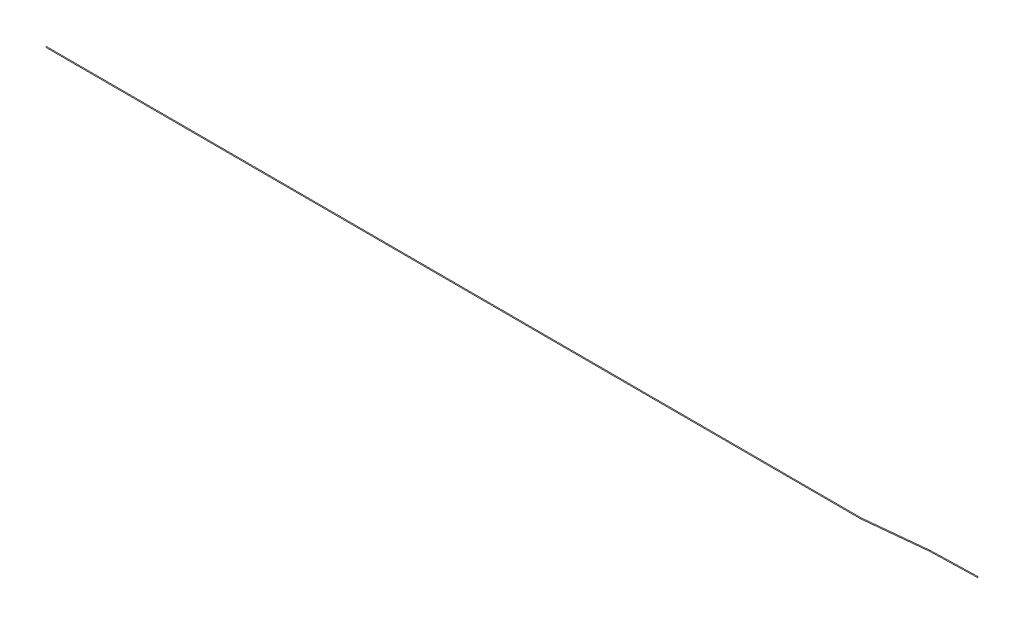
ISO-10303-21;
HEADER;
FILE_DESCRIPTION(('STEP AP214'),'2;1');
FILE_NAME('part.step','',(''),(''),'','','');
FILE_SCHEMA(('AUTOMOTIVE_DESIGN { 1 0 10303 214 1 1 1 1 }'));
ENDSEC;
DATA;
#1=APPLICATION_CONTEXT('core data for automotive mechanical design processes');
#2=APPLICATION_PROTOCOL_DEFINITION('international standard','automotive_design',2000,#1);
#3=PRODUCT_CONTEXT('',#1,'mechanical');
#4=PRODUCT('Part','Part','',(#3));
#5=PRODUCT_RELATED_PRODUCT_CATEGORY('part','',(#4));
#6=PRODUCT_DEFINITION_FORMATION('','',#4);
#7=PRODUCT_DEFINITION_CONTEXT('part definition',#1,'design');
#8=PRODUCT_DEFINITION('design','',#6,#7);
#9=PRODUCT_DEFINITION_SHAPE('','',#8);
#10=(LENGTH_UNIT() NAMED_UNIT(*) SI_UNIT(.MILLI.,.METRE.));
#11=(NAMED_UNIT(*) PLANE_ANGLE_UNIT() SI_UNIT($,.RADIAN.));
#12=(NAMED_UNIT(*) SI_UNIT($,.STERADIAN.) SOLID_ANGLE_UNIT());
#13=UNCERTAINTY_MEASURE_WITH_UNIT(LENGTH_MEASURE(1.E-05),#10,'distance_accuracy_value','');
#14=(GEOMETRIC_REPRESENTATION_CONTEXT(3) GLOBAL_UNCERTAINTY_ASSIGNED_CONTEXT((#13)) GLOBAL_UNIT_ASSIGNED_CONTEXT((#10,
#11,#12)) REPRESENTATION_CONTEXT('',''));
#15=CARTESIAN_POINT('',(0.,0.,0.));
#16=DIRECTION('',(0.,0.,1.));
#17=DIRECTION('',(1.,0.,0.));
#18=AXIS2_PLACEMENT_3D('',#15,#16,#17);
#19=CARTESIAN_POINT('',(476.296907948594,8.31432144742233,-39.0391737958979));
#20=DIRECTION('',(-0.999794440856846,-0.0187432383096116,0.00773091517319408));
#21=DIRECTION('',(0.0187437984487453,-0.999824319578051,0.));
#22=AXIS2_PLACEMENT_3D('',#19,#20,#21);
#23=PLANE('',#22);
#24=CARTESIAN_POINT('',(476.296907948594,8.31432144742233,-39.0391737958979));
#25=DIRECTION('',(-0.999794440856846,-0.0187432383096116,0.00773091517319408));
#26=DIRECTION('',(0.0187437984487453,-0.999824319578051,0.));
#27=AXIS2_PLACEMENT_3D('',#24,#25,#26);
#28=CIRCLE('',#27,0.324999999999998);
#29=CARTESIAN_POINT('',(476.30299968309,7.98937854355947,-39.0391737958979));
#30=VERTEX_POINT('',#29);
#31=EDGE_CURVE('E39',#30,#30,#28,.T.);
#32=ORIENTED_EDGE('',*,*,#31,.F.);
#33=EDGE_LOOP('',(#32));
#34=FACE_BOUND('',#33,.T.);
#35=ADVANCED_FACE('F36',(#34),#23,.F.);
#36=CARTESIAN_POINT('',(-275.601885048913,9.61449752002197,-32.2798614559297));
#37=DIRECTION('',(-0.999995260819535,0.00265906684126821,0.00155167715806016));
#38=DIRECTION('',(-0.00265714731080984,-0.999995703674146,0.00123782123840008));
#39=AXIS2_PLACEMENT_3D('',#36,#37,#38);
#40=PLANE('',#39);
#41=CARTESIAN_POINT('',(-275.601885048913,9.61449752002197,-32.2798614559297));
#42=DIRECTION('',(-0.999995260819535,0.00265906684126821,0.00155167715806016));
#43=DIRECTION('',(-0.00265714731080984,-0.999995703674146,0.00123782123840008));
#44=AXIS2_PLACEMENT_3D('',#41,#42,#43);
#45=CIRCLE('',#44,0.324999999999998);
#46=CARTESIAN_POINT('',(-275.602748621789,9.28949891632788,-32.2794591640272));
#47=VERTEX_POINT('',#46);
#48=EDGE_CURVE('E43',#47,#47,#45,.T.);
#49=ORIENTED_EDGE('',*,*,#48,.T.);
#50=EDGE_LOOP('',(#49));
#51=FACE_BOUND('',#50,.T.);
#52=ADVANCED_FACE('F59',(#51),#40,.T.);
#53=CARTESIAN_POINT('',(437.312484089372,7.5834768688807,-38.7377265567302));
#54=DIRECTION('',(0.999794440856846,0.0187432383096116,-0.00773091517319406));
#55=DIRECTION('',(-0.0187437984487453,0.999824319578051,0.));
#56=AXIS2_PLACEMENT_3D('',#53,#54,#55);
#57=CYLINDRICAL_SURFACE('',#56,0.324999999999998);
#58=CARTESIAN_POINT('',(437.512442977544,7.58722551654262,-38.7392727397648));
#59=DIRECTION('',(0.998328984086488,0.00676897488627751,-0.057388330798424));
#60=DIRECTION('',(-0.0542031073578957,-0.234571491114329,-0.970586543647268));
#61=AXIS2_PLACEMENT_3D('',#58,#59,#60);
#62=ELLIPSE('',#61,0.325424905586617,0.324999999999998);
#63=CARTESIAN_POINT('',(437.494803936449,7.51089011119343,-39.0551257740949));
#64=VERTEX_POINT('',#63);
#65=EDGE_CURVE('E48',#64,#64,#62,.T.);
#66=ORIENTED_EDGE('',*,*,#65,.T.);
#67=EDGE_LOOP('',(#66));
#68=FACE_BOUND('',#67,.T.);
#69=ORIENTED_EDGE('',*,*,#31,.T.);
#70=EDGE_LOOP('',(#69));
#71=FACE_BOUND('',#70,.T.);
#72=ADVANCED_FACE('F56',(#68,#71),#57,.T.);
#73=CARTESIAN_POINT('',(386.796444961686,7.8536435691186,-33.2866240630862));
#74=DIRECTION('',(0.994256501514845,-0.00522296496682882,-0.106895883140639));
#75=DIRECTION('',(-0.106897341196272,0.,-0.994270063134342));
#76=AXIS2_PLACEMENT_3D('',#73,#74,#75);
#77=CYLINDRICAL_SURFACE('',#76,0.324999999999998);
#78=CARTESIAN_POINT('',(386.995296261989,7.85259897612523,-33.3080032397144));
#79=DIRECTION('',(0.998516899007707,-0.00394651372888269,-0.0542994238037693));
#80=DIRECTION('',(0.0543795589544756,0.0242950857266705,0.998224730397645));
#81=AXIS2_PLACEMENT_3D('',#78,#79,#80);
#82=ELLIPSE('',#81,0.325453383877306,0.324999999999998);
#83=CARTESIAN_POINT('',(387.012994273465,7.86050589398656,-32.9831276233364));
#84=VERTEX_POINT('',#83);
#85=EDGE_CURVE('E11',#84,#84,#82,.T.);
#86=ORIENTED_EDGE('',*,*,#85,.T.);
#87=EDGE_LOOP('',(#86));
#88=FACE_BOUND('',#87,.T.);
#89=ORIENTED_EDGE('',*,*,#65,.F.);
#90=EDGE_LOOP('',(#89));
#91=FACE_BOUND('',#90,.T.);
#92=ADVANCED_FACE('F66',(#88,#91),#77,.T.);
#93=CARTESIAN_POINT('',(-275.601885048913,9.61449752002197,-32.2798614559297));
#94=DIRECTION('',(0.999995260819535,-0.00265906684126819,-0.00155167715806016));
#95=DIRECTION('',(0.00265907004239425,0.999996464667006,0.));
#96=AXIS2_PLACEMENT_3D('',#93,#94,#95);
#97=CYLINDRICAL_SURFACE('',#96,0.324999999999998);
#98=ORIENTED_EDGE('',*,*,#48,.F.);
#99=EDGE_LOOP('',(#98));
#100=FACE_BOUND('',#99,.T.);
#101=ORIENTED_EDGE('',*,*,#85,.F.);
#102=EDGE_LOOP('',(#101));
#103=FACE_BOUND('',#102,.T.);
#104=ADVANCED_FACE('F64',(#100,#103),#97,.T.);
#105=CLOSED_SHELL('',(#35,#52,#72,#92,#104));
#106=MANIFOLD_SOLID_BREP('B2',#105);
#107=ADVANCED_BREP_SHAPE_REPRESENTATION('',(#18,#106),#14);
#108=SHAPE_DEFINITION_REPRESENTATION(#9,#107);
ENDSEC;
END-ISO-10303-21;
